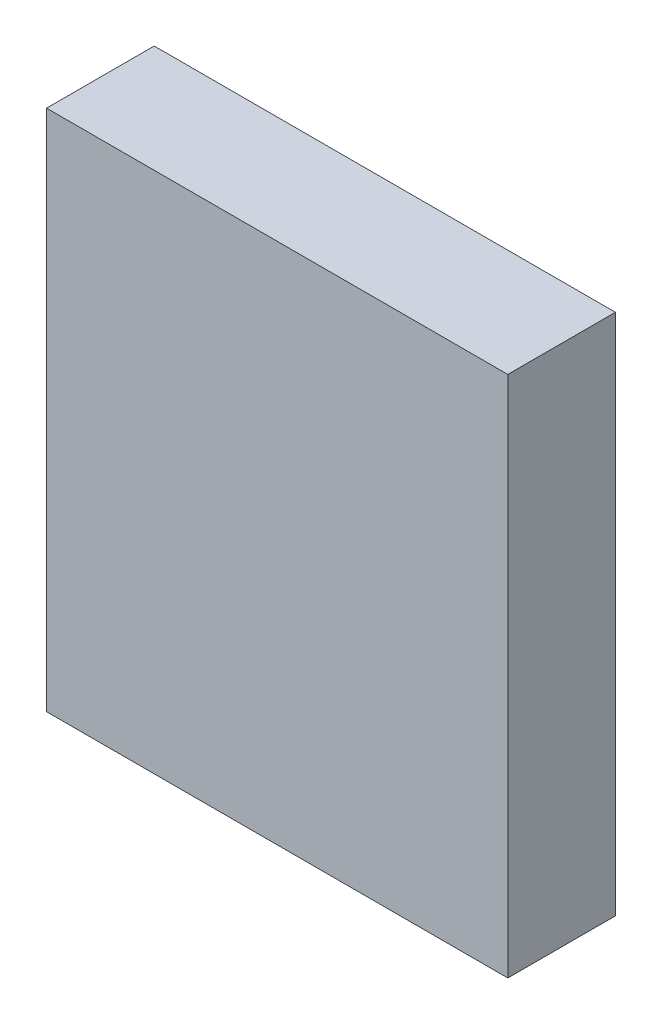
ISO-10303-21;
HEADER;
FILE_DESCRIPTION(('STEP AP214'),'2;1');
FILE_NAME('part.step','',(''),(''),'','','');
FILE_SCHEMA(('AUTOMOTIVE_DESIGN { 1 0 10303 214 1 1 1 1 }'));
ENDSEC;
DATA;
#1=APPLICATION_CONTEXT('core data for automotive mechanical design processes');
#2=APPLICATION_PROTOCOL_DEFINITION('international standard','automotive_design',2000,#1);
#3=PRODUCT_CONTEXT('',#1,'mechanical');
#4=PRODUCT('Part','Part','',(#3));
#5=PRODUCT_RELATED_PRODUCT_CATEGORY('part','',(#4));
#6=PRODUCT_DEFINITION_FORMATION('','',#4);
#7=PRODUCT_DEFINITION_CONTEXT('part definition',#1,'design');
#8=PRODUCT_DEFINITION('design','',#6,#7);
#9=PRODUCT_DEFINITION_SHAPE('','',#8);
#10=(LENGTH_UNIT() NAMED_UNIT(*) SI_UNIT(.MILLI.,.METRE.));
#11=(NAMED_UNIT(*) PLANE_ANGLE_UNIT() SI_UNIT($,.RADIAN.));
#12=(NAMED_UNIT(*) SI_UNIT($,.STERADIAN.) SOLID_ANGLE_UNIT());
#13=UNCERTAINTY_MEASURE_WITH_UNIT(LENGTH_MEASURE(1.E-05),#10,'distance_accuracy_value','');
#14=(GEOMETRIC_REPRESENTATION_CONTEXT(3) GLOBAL_UNCERTAINTY_ASSIGNED_CONTEXT((#13)) GLOBAL_UNIT_ASSIGNED_CONTEXT((#10,
#11,#12)) REPRESENTATION_CONTEXT('',''));
#15=CARTESIAN_POINT('',(0.,0.,0.));
#16=DIRECTION('',(0.,0.,1.));
#17=DIRECTION('',(1.,0.,0.));
#18=AXIS2_PLACEMENT_3D('',#15,#16,#17);
#19=CARTESIAN_POINT('',(11.00000122,55.0000006,-1.656522024752));
#20=DIRECTION('',(0.,0.,1.));
#21=DIRECTION('',(1.,0.,0.));
#22=AXIS2_PLACEMENT_3D('',#19,#20,#21);
#23=PLANE('',#22);
#24=DIRECTION('',(0.,1.,0.));
#25=VECTOR('',#24,1.);
#26=CARTESIAN_POINT('',(13.2500018,52.45000062,-1.656522024752));
#27=LINE('',#26,#25);
#28=CARTESIAN_POINT('',(13.2500018,52.45000062,-1.656522024752));
#29=VERTEX_POINT('',#28);
#30=CARTESIAN_POINT('',(13.2500018,57.55000058,-1.656522024752));
#31=VERTEX_POINT('',#30);
#32=EDGE_CURVE('E76',#29,#31,#27,.T.);
#33=ORIENTED_EDGE('',*,*,#32,.T.);
#34=DIRECTION('',(1.,0.,0.));
#35=VECTOR('',#34,1.);
#36=CARTESIAN_POINT('',(13.2500018,57.55000058,-1.656522024752));
#37=LINE('',#36,#35);
#38=CARTESIAN_POINT('',(8.75000064,57.55000058,-1.656522024752));
#39=VERTEX_POINT('',#38);
#40=EDGE_CURVE('E58',#31,#39,#37,.F.);
#41=ORIENTED_EDGE('',*,*,#40,.T.);
#42=DIRECTION('',(0.,1.,0.));
#43=VECTOR('',#42,1.);
#44=CARTESIAN_POINT('',(8.75000064,57.55000058,-1.656522024752));
#45=LINE('',#44,#43);
#46=CARTESIAN_POINT('',(8.75000064,52.45000062,-1.656522024752));
#47=VERTEX_POINT('',#46);
#48=EDGE_CURVE('E20',#39,#47,#45,.F.);
#49=ORIENTED_EDGE('',*,*,#48,.T.);
#50=DIRECTION('',(1.,0.,0.));
#51=VECTOR('',#50,1.);
#52=CARTESIAN_POINT('',(8.75000064,52.45000062,-1.656522024752));
#53=LINE('',#52,#51);
#54=EDGE_CURVE('E55',#47,#29,#53,.T.);
#55=ORIENTED_EDGE('',*,*,#54,.T.);
#56=EDGE_LOOP('',(#33,#41,#49,#55));
#57=FACE_BOUND('',#56,.T.);
#58=ADVANCED_FACE('F17',(#57),#23,.T.);
#59=CARTESIAN_POINT('',(8.75000064,57.55000058,-2.706522464752));
#60=DIRECTION('',(1.,0.,0.));
#61=DIRECTION('',(0.,0.,-1.));
#62=AXIS2_PLACEMENT_3D('',#59,#60,#61);
#63=PLANE('',#62);
#64=DIRECTION('',(0.,0.,1.));
#65=VECTOR('',#64,1.);
#66=CARTESIAN_POINT('',(8.75000064,52.45000062,-2.706522464752));
#67=LINE('',#66,#65);
#68=CARTESIAN_POINT('',(8.75000064,52.45000062,-2.706522464752));
#69=VERTEX_POINT('',#68);
#70=EDGE_CURVE('E63',#69,#47,#67,.T.);
#71=ORIENTED_EDGE('',*,*,#70,.T.);
#72=ORIENTED_EDGE('',*,*,#48,.F.);
#73=DIRECTION('',(0.,0.,-1.));
#74=VECTOR('',#73,1.);
#75=CARTESIAN_POINT('',(8.75000064,57.55000058,-2.706522464752));
#76=LINE('',#75,#74);
#77=CARTESIAN_POINT('',(8.75000064,57.55000058,-2.706522464752));
#78=VERTEX_POINT('',#77);
#79=EDGE_CURVE('E80',#39,#78,#76,.T.);
#80=ORIENTED_EDGE('',*,*,#79,.T.);
#81=DIRECTION('',(0.,1.,0.));
#82=VECTOR('',#81,1.);
#83=CARTESIAN_POINT('',(8.75000064,55.0000006,-2.706522464752));
#84=LINE('',#83,#82);
#85=EDGE_CURVE('E73',#78,#69,#84,.F.);
#86=ORIENTED_EDGE('',*,*,#85,.T.);
#87=EDGE_LOOP('',(#71,#72,#80,#86));
#88=FACE_BOUND('',#87,.T.);
#89=ADVANCED_FACE('F72',(#88),#63,.F.);
#90=CARTESIAN_POINT('',(8.75000064,52.45000062,-2.706522464752));
#91=DIRECTION('',(0.,1.,0.));
#92=DIRECTION('',(0.,0.,1.));
#93=AXIS2_PLACEMENT_3D('',#90,#91,#92);
#94=PLANE('',#93);
#95=DIRECTION('',(0.,0.,1.));
#96=VECTOR('',#95,1.);
#97=CARTESIAN_POINT('',(13.2500018,52.45000062,-2.706522464752));
#98=LINE('',#97,#96);
#99=CARTESIAN_POINT('',(13.2500018,52.45000062,-2.706522464752));
#100=VERTEX_POINT('',#99);
#101=EDGE_CURVE('E69',#100,#29,#98,.T.);
#102=ORIENTED_EDGE('',*,*,#101,.T.);
#103=ORIENTED_EDGE('',*,*,#54,.F.);
#104=ORIENTED_EDGE('',*,*,#70,.F.);
#105=DIRECTION('',(1.,0.,0.));
#106=VECTOR('',#105,1.);
#107=CARTESIAN_POINT('',(11.00000122,52.45000062,-2.706522464752));
#108=LINE('',#107,#106);
#109=EDGE_CURVE('E83',#69,#100,#108,.T.);
#110=ORIENTED_EDGE('',*,*,#109,.T.);
#111=EDGE_LOOP('',(#102,#103,#104,#110));
#112=FACE_BOUND('',#111,.T.);
#113=ADVANCED_FACE('F66',(#112),#94,.F.);
#114=CARTESIAN_POINT('',(13.2500018,52.45000062,-2.706522464752));
#115=DIRECTION('',(-1.,0.,0.));
#116=DIRECTION('',(0.,0.,1.));
#117=AXIS2_PLACEMENT_3D('',#114,#115,#116);
#118=PLANE('',#117);
#119=DIRECTION('',(0.,0.,-1.));
#120=VECTOR('',#119,1.);
#121=CARTESIAN_POINT('',(13.2500018,57.55000058,-2.706522464752));
#122=LINE('',#121,#120);
#123=CARTESIAN_POINT('',(13.2500018,57.55000058,-2.706522464752));
#124=VERTEX_POINT('',#123);
#125=EDGE_CURVE('E34',#124,#31,#122,.F.);
#126=ORIENTED_EDGE('',*,*,#125,.T.);
#127=ORIENTED_EDGE('',*,*,#32,.F.);
#128=ORIENTED_EDGE('',*,*,#101,.F.);
#129=DIRECTION('',(0.,1.,0.));
#130=VECTOR('',#129,1.);
#131=CARTESIAN_POINT('',(13.2500018,55.0000006,-2.706522464752));
#132=LINE('',#131,#130);
#133=EDGE_CURVE('E26',#100,#124,#132,.T.);
#134=ORIENTED_EDGE('',*,*,#133,.T.);
#135=EDGE_LOOP('',(#126,#127,#128,#134));
#136=FACE_BOUND('',#135,.T.);
#137=ADVANCED_FACE('F88',(#136),#118,.F.);
#138=CARTESIAN_POINT('',(13.2500018,57.55000058,-2.706522464752));
#139=DIRECTION('',(0.,-1.,0.));
#140=DIRECTION('',(0.,0.,-1.));
#141=AXIS2_PLACEMENT_3D('',#138,#139,#140);
#142=PLANE('',#141);
#143=ORIENTED_EDGE('',*,*,#79,.F.);
#144=ORIENTED_EDGE('',*,*,#40,.F.);
#145=ORIENTED_EDGE('',*,*,#125,.F.);
#146=DIRECTION('',(1.,0.,0.));
#147=VECTOR('',#146,1.);
#148=CARTESIAN_POINT('',(11.00000122,57.55000058,-2.706522464752));
#149=LINE('',#148,#147);
#150=EDGE_CURVE('E11',#124,#78,#149,.F.);
#151=ORIENTED_EDGE('',*,*,#150,.T.);
#152=EDGE_LOOP('',(#143,#144,#145,#151));
#153=FACE_BOUND('',#152,.T.);
#154=ADVANCED_FACE('F91',(#153),#142,.F.);
#155=CARTESIAN_POINT('',(11.00000122,55.0000006,-2.706522464752));
#156=DIRECTION('',(0.,0.,1.));
#157=DIRECTION('',(1.,0.,0.));
#158=AXIS2_PLACEMENT_3D('',#155,#156,#157);
#159=PLANE('',#158);
#160=ORIENTED_EDGE('',*,*,#133,.F.);
#161=ORIENTED_EDGE('',*,*,#109,.F.);
#162=ORIENTED_EDGE('',*,*,#85,.F.);
#163=ORIENTED_EDGE('',*,*,#150,.F.);
#164=EDGE_LOOP('',(#160,#161,#162,#163));
#165=FACE_BOUND('',#164,.T.);
#166=ADVANCED_FACE('F90',(#165),#159,.F.);
#167=CLOSED_SHELL('',(#58,#89,#113,#137,#154,#166));
#168=MANIFOLD_SOLID_BREP('B1',#167);
#169=ADVANCED_BREP_SHAPE_REPRESENTATION('',(#18,#168),#14);
#170=SHAPE_DEFINITION_REPRESENTATION(#9,#169);
ENDSEC;
END-ISO-10303-21;
